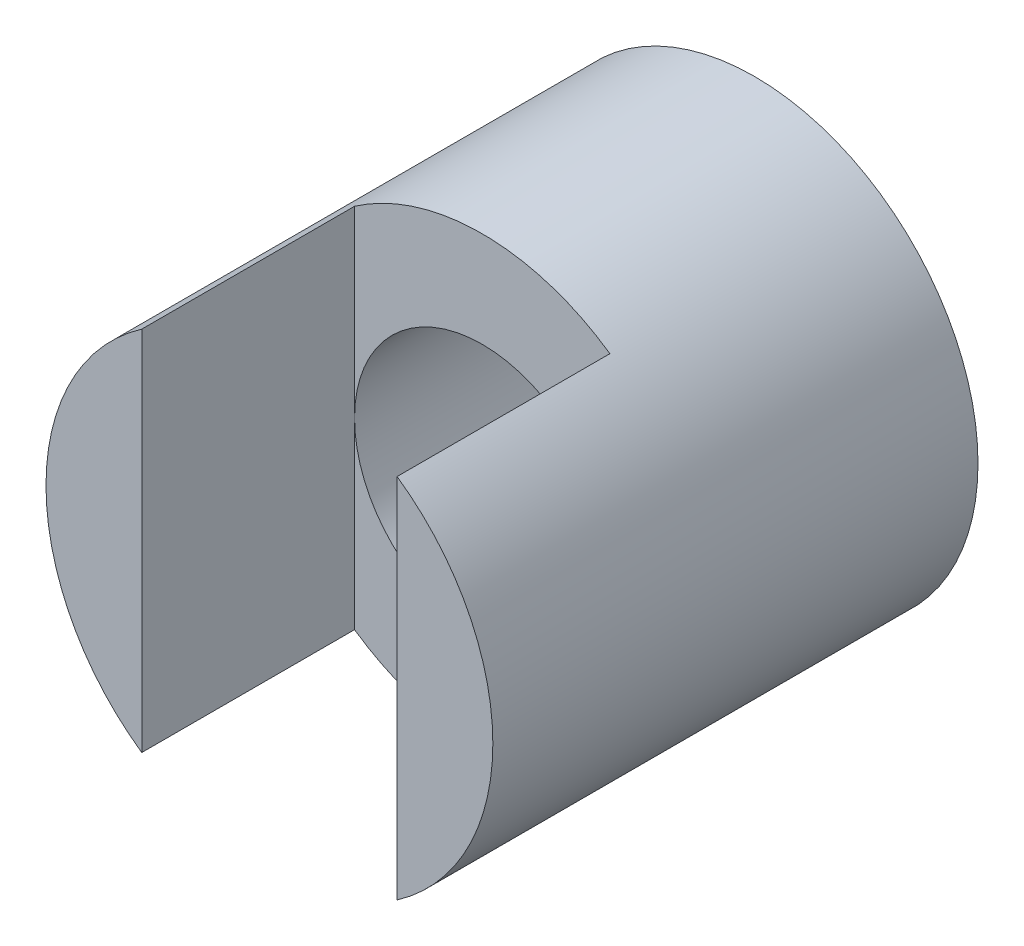
ISO-10303-21;
HEADER;
FILE_DESCRIPTION(('STEP AP214'),'2;1');
FILE_NAME('part.step','',(''),(''),'','','');
FILE_SCHEMA(('AUTOMOTIVE_DESIGN { 1 0 10303 214 1 1 1 1 }'));
ENDSEC;
DATA;
#1=APPLICATION_CONTEXT('core data for automotive mechanical design processes');
#2=APPLICATION_PROTOCOL_DEFINITION('international standard','automotive_design',2000,#1);
#3=PRODUCT_CONTEXT('',#1,'mechanical');
#4=PRODUCT('Part','Part','',(#3));
#5=PRODUCT_RELATED_PRODUCT_CATEGORY('part','',(#4));
#6=PRODUCT_DEFINITION_FORMATION('','',#4);
#7=PRODUCT_DEFINITION_CONTEXT('part definition',#1,'design');
#8=PRODUCT_DEFINITION('design','',#6,#7);
#9=PRODUCT_DEFINITION_SHAPE('','',#8);
#10=(LENGTH_UNIT() NAMED_UNIT(*) SI_UNIT(.MILLI.,.METRE.));
#11=(NAMED_UNIT(*) PLANE_ANGLE_UNIT() SI_UNIT($,.RADIAN.));
#12=(NAMED_UNIT(*) SI_UNIT($,.STERADIAN.) SOLID_ANGLE_UNIT());
#13=UNCERTAINTY_MEASURE_WITH_UNIT(LENGTH_MEASURE(1.E-05),#10,'distance_accuracy_value','');
#14=(GEOMETRIC_REPRESENTATION_CONTEXT(3) GLOBAL_UNCERTAINTY_ASSIGNED_CONTEXT((#13)) GLOBAL_UNIT_ASSIGNED_CONTEXT((#10,
#11,#12)) REPRESENTATION_CONTEXT('',''));
#15=CARTESIAN_POINT('',(0.,0.,0.));
#16=DIRECTION('',(0.,0.,1.));
#17=DIRECTION('',(1.,0.,0.));
#18=AXIS2_PLACEMENT_3D('',#15,#16,#17);
#19=CARTESIAN_POINT('',(4.125,0.,5.));
#20=DIRECTION('',(0.,0.,1.));
#21=DIRECTION('',(1.,0.,0.));
#22=AXIS2_PLACEMENT_3D('',#19,#20,#21);
#23=PLANE('',#22);
#24=CARTESIAN_POINT('',(0.,0.,5.));
#25=DIRECTION('',(0.,0.,1.));
#26=DIRECTION('',(1.,0.,0.));
#27=AXIS2_PLACEMENT_3D('',#24,#25,#26);
#28=CIRCLE('',#27,5.25);
#29=CARTESIAN_POINT('',(3.,-4.30842198490352,5.));
#30=VERTEX_POINT('',#29);
#31=CARTESIAN_POINT('',(3.,4.30842198490352,5.));
#32=VERTEX_POINT('',#31);
#33=EDGE_CURVE('E25',#30,#32,#28,.T.);
#34=ORIENTED_EDGE('',*,*,#33,.T.);
#35=DIRECTION('',(0.,-1.,0.));
#36=VECTOR('',#35,1.);
#37=CARTESIAN_POINT('',(3.,4.30842198490352,5.));
#38=LINE('',#37,#36);
#39=EDGE_CURVE('E126',#32,#30,#38,.T.);
#40=ORIENTED_EDGE('',*,*,#39,.T.);
#41=EDGE_LOOP('',(#34,#40));
#42=FACE_BOUND('',#41,.T.);
#43=ADVANCED_FACE('F17',(#42),#23,.T.);
#44=CARTESIAN_POINT('',(0.,0.,0.));
#45=DIRECTION('',(0.,0.,1.));
#46=DIRECTION('',(1.,0.,0.));
#47=AXIS2_PLACEMENT_3D('',#44,#45,#46);
#48=CYLINDRICAL_SURFACE('',#47,5.25);
#49=DIRECTION('',(0.,0.,1.));
#50=VECTOR('',#49,1.);
#51=CARTESIAN_POINT('',(3.,4.30842198490352,0.));
#52=LINE('',#51,#50);
#53=CARTESIAN_POINT('',(3.,4.30842198490352,0.));
#54=VERTEX_POINT('',#53);
#55=EDGE_CURVE('E129',#54,#32,#52,.T.);
#56=ORIENTED_EDGE('',*,*,#55,.T.);
#57=ORIENTED_EDGE('',*,*,#33,.F.);
#58=DIRECTION('',(0.,0.,1.));
#59=VECTOR('',#58,1.);
#60=CARTESIAN_POINT('',(3.,-4.30842198490352,0.));
#61=LINE('',#60,#59);
#62=CARTESIAN_POINT('',(3.,-4.30842198490352,0.));
#63=VERTEX_POINT('',#62);
#64=EDGE_CURVE('E84',#63,#30,#61,.T.);
#65=ORIENTED_EDGE('',*,*,#64,.F.);
#66=CARTESIAN_POINT('',(0.,0.,0.));
#67=DIRECTION('',(0.,0.,1.));
#68=DIRECTION('',(1.,0.,0.));
#69=AXIS2_PLACEMENT_3D('',#66,#67,#68);
#70=CIRCLE('',#69,5.25);
#71=CARTESIAN_POINT('',(-3.,-4.30842198490352,0.));
#72=VERTEX_POINT('',#71);
#73=EDGE_CURVE('E93',#72,#63,#70,.T.);
#74=ORIENTED_EDGE('',*,*,#73,.F.);
#75=DIRECTION('',(0.,0.,1.));
#76=VECTOR('',#75,1.);
#77=CARTESIAN_POINT('',(-3.,-4.30842198490352,0.));
#78=LINE('',#77,#76);
#79=CARTESIAN_POINT('',(-3.,-4.30842198490352,5.));
#80=VERTEX_POINT('',#79);
#81=EDGE_CURVE('E86',#72,#80,#78,.T.);
#82=ORIENTED_EDGE('',*,*,#81,.T.);
#83=CARTESIAN_POINT('',(0.,0.,5.));
#84=DIRECTION('',(0.,0.,1.));
#85=DIRECTION('',(1.,0.,0.));
#86=AXIS2_PLACEMENT_3D('',#83,#84,#85);
#87=CIRCLE('',#86,5.25);
#88=CARTESIAN_POINT('',(-5.25,0.,5.));
#89=VERTEX_POINT('',#88);
#90=EDGE_CURVE('E80',#89,#80,#87,.T.);
#91=ORIENTED_EDGE('',*,*,#90,.F.);
#92=DIRECTION('',(0.,0.,-1.));
#93=VECTOR('',#92,1.);
#94=CARTESIAN_POINT('',(-5.25,0.,0.));
#95=LINE('',#94,#93);
#96=CARTESIAN_POINT('',(-5.25,0.,-6.4));
#97=VERTEX_POINT('',#96);
#98=EDGE_CURVE('E11',#89,#97,#95,.T.);
#99=ORIENTED_EDGE('',*,*,#98,.T.);
#100=CARTESIAN_POINT('',(0.,0.,-6.4));
#101=DIRECTION('',(0.,0.,-1.));
#102=DIRECTION('',(1.,0.,0.));
#103=AXIS2_PLACEMENT_3D('',#100,#101,#102);
#104=CIRCLE('',#103,5.25);
#105=EDGE_CURVE('E106',#97,#97,#104,.T.);
#106=ORIENTED_EDGE('',*,*,#105,.F.);
#107=ORIENTED_EDGE('',*,*,#98,.F.);
#108=CARTESIAN_POINT('',(0.,0.,5.));
#109=DIRECTION('',(0.,0.,1.));
#110=DIRECTION('',(1.,0.,0.));
#111=AXIS2_PLACEMENT_3D('',#108,#109,#110);
#112=CIRCLE('',#111,5.25);
#113=CARTESIAN_POINT('',(-3.,4.30842198490352,5.));
#114=VERTEX_POINT('',#113);
#115=EDGE_CURVE('E83',#114,#89,#112,.T.);
#116=ORIENTED_EDGE('',*,*,#115,.F.);
#117=DIRECTION('',(0.,0.,1.));
#118=VECTOR('',#117,1.);
#119=CARTESIAN_POINT('',(-3.,4.30842198490352,0.));
#120=LINE('',#119,#118);
#121=CARTESIAN_POINT('',(-3.,4.30842198490352,0.));
#122=VERTEX_POINT('',#121);
#123=EDGE_CURVE('E97',#122,#114,#120,.T.);
#124=ORIENTED_EDGE('',*,*,#123,.F.);
#125=CARTESIAN_POINT('',(0.,0.,0.));
#126=DIRECTION('',(0.,0.,1.));
#127=DIRECTION('',(1.,0.,0.));
#128=AXIS2_PLACEMENT_3D('',#125,#126,#127);
#129=CIRCLE('',#128,5.25);
#130=EDGE_CURVE('E115',#54,#122,#129,.T.);
#131=ORIENTED_EDGE('',*,*,#130,.F.);
#132=EDGE_LOOP('',(#56,#57,#65,#74,#82,#91,#99,#106,#107,#116,#124,#131));
#133=FACE_BOUND('',#132,.T.);
#134=ADVANCED_FACE('F90',(#133),#48,.T.);
#135=CARTESIAN_POINT('',(3.,4.30842198490352,0.));
#136=DIRECTION('',(-1.,0.,0.));
#137=DIRECTION('',(0.,0.,1.));
#138=AXIS2_PLACEMENT_3D('',#135,#136,#137);
#139=PLANE('',#138);
#140=DIRECTION('',(0.,-1.,0.));
#141=VECTOR('',#140,1.);
#142=CARTESIAN_POINT('',(3.,4.30842198490352,0.));
#143=LINE('',#142,#141);
#144=CARTESIAN_POINT('',(3.,0.,0.));
#145=VERTEX_POINT('',#144);
#146=EDGE_CURVE('E109',#54,#145,#143,.T.);
#147=ORIENTED_EDGE('',*,*,#146,.T.);
#148=DIRECTION('',(0.,-1.,0.));
#149=VECTOR('',#148,1.);
#150=CARTESIAN_POINT('',(3.,4.30842198490352,0.));
#151=LINE('',#150,#149);
#152=EDGE_CURVE('E215',#145,#63,#151,.T.);
#153=ORIENTED_EDGE('',*,*,#152,.T.);
#154=ORIENTED_EDGE('',*,*,#64,.T.);
#155=ORIENTED_EDGE('',*,*,#39,.F.);
#156=ORIENTED_EDGE('',*,*,#55,.F.);
#157=EDGE_LOOP('',(#147,#153,#154,#155,#156));
#158=FACE_BOUND('',#157,.T.);
#159=ADVANCED_FACE('F226',(#158),#139,.T.);
#160=CARTESIAN_POINT('',(-4.125,0.,5.));
#161=DIRECTION('',(0.,0.,1.));
#162=DIRECTION('',(1.,0.,0.));
#163=AXIS2_PLACEMENT_3D('',#160,#161,#162);
#164=PLANE('',#163);
#165=DIRECTION('',(0.,1.,0.));
#166=VECTOR('',#165,1.);
#167=CARTESIAN_POINT('',(-3.,-4.30842198490352,5.));
#168=LINE('',#167,#166);
#169=EDGE_CURVE('E81',#80,#114,#168,.T.);
#170=ORIENTED_EDGE('',*,*,#169,.T.);
#171=ORIENTED_EDGE('',*,*,#115,.T.);
#172=ORIENTED_EDGE('',*,*,#90,.T.);
#173=EDGE_LOOP('',(#170,#171,#172));
#174=FACE_BOUND('',#173,.T.);
#175=ADVANCED_FACE('F78',(#174),#164,.T.);
#176=CARTESIAN_POINT('',(-3.,-4.30842198490352,0.));
#177=DIRECTION('',(1.,0.,0.));
#178=DIRECTION('',(0.,1.,0.));
#179=AXIS2_PLACEMENT_3D('',#176,#177,#178);
#180=PLANE('',#179);
#181=DIRECTION('',(0.,1.,0.));
#182=VECTOR('',#181,1.);
#183=CARTESIAN_POINT('',(-3.,-4.30842198490352,0.));
#184=LINE('',#183,#182);
#185=CARTESIAN_POINT('',(-3.,0.,0.));
#186=VERTEX_POINT('',#185);
#187=EDGE_CURVE('E192',#72,#186,#184,.T.);
#188=ORIENTED_EDGE('',*,*,#187,.T.);
#189=DIRECTION('',(0.,1.,0.));
#190=VECTOR('',#189,1.);
#191=CARTESIAN_POINT('',(-3.,-4.30842198490352,0.));
#192=LINE('',#191,#190);
#193=EDGE_CURVE('E116',#186,#122,#192,.T.);
#194=ORIENTED_EDGE('',*,*,#193,.T.);
#195=ORIENTED_EDGE('',*,*,#123,.T.);
#196=ORIENTED_EDGE('',*,*,#169,.F.);
#197=ORIENTED_EDGE('',*,*,#81,.F.);
#198=EDGE_LOOP('',(#188,#194,#195,#196,#197));
#199=FACE_BOUND('',#198,.T.);
#200=ADVANCED_FACE('F100',(#199),#180,.T.);
#201=CARTESIAN_POINT('',(0.,0.,-6.4));
#202=DIRECTION('',(0.,0.,1.));
#203=DIRECTION('',(1.,0.,0.));
#204=AXIS2_PLACEMENT_3D('',#201,#202,#203);
#205=PLANE('',#204);
#206=CARTESIAN_POINT('',(0.,0.,-6.4));
#207=DIRECTION('',(0.,0.,1.));
#208=DIRECTION('',(-1.,0.,0.));
#209=AXIS2_PLACEMENT_3D('',#206,#207,#208);
#210=CIRCLE('',#209,3.);
#211=CARTESIAN_POINT('',(3.,0.,-6.4));
#212=VERTEX_POINT('',#211);
#213=EDGE_CURVE('E190',#212,#212,#210,.T.);
#214=ORIENTED_EDGE('',*,*,#213,.T.);
#215=EDGE_LOOP('',(#214));
#216=FACE_BOUND('',#215,.T.);
#217=ORIENTED_EDGE('',*,*,#105,.T.);
#218=EDGE_LOOP('',(#217));
#219=FACE_BOUND('',#218,.T.);
#220=ADVANCED_FACE('F250',(#216,#219),#205,.F.);
#221=CARTESIAN_POINT('',(0.,0.,0.));
#222=DIRECTION('',(0.,0.,1.));
#223=DIRECTION('',(1.,0.,0.));
#224=AXIS2_PLACEMENT_3D('',#221,#222,#223);
#225=PLANE('',#224);
#226=ORIENTED_EDGE('',*,*,#146,.F.);
#227=ORIENTED_EDGE('',*,*,#130,.T.);
#228=ORIENTED_EDGE('',*,*,#193,.F.);
#229=CARTESIAN_POINT('',(0.,0.,0.));
#230=DIRECTION('',(0.,0.,-1.));
#231=DIRECTION('',(-1.,0.,0.));
#232=AXIS2_PLACEMENT_3D('',#229,#230,#231);
#233=CIRCLE('',#232,3.);
#234=EDGE_CURVE('E175',#186,#145,#233,.T.);
#235=ORIENTED_EDGE('',*,*,#234,.T.);
#236=EDGE_LOOP('',(#226,#227,#228,#235));
#237=FACE_BOUND('',#236,.T.);
#238=ADVANCED_FACE('F249',(#237),#225,.T.);
#239=CARTESIAN_POINT('',(0.,0.,0.));
#240=DIRECTION('',(0.,0.,-1.));
#241=DIRECTION('',(-1.,0.,0.));
#242=AXIS2_PLACEMENT_3D('',#239,#240,#241);
#243=CYLINDRICAL_SURFACE('',#242,3.);
#244=ORIENTED_EDGE('',*,*,#213,.F.);
#245=DIRECTION('',(0.,0.,1.));
#246=VECTOR('',#245,1.);
#247=CARTESIAN_POINT('',(3.,0.,0.));
#248=LINE('',#247,#246);
#249=EDGE_CURVE('E185',#212,#145,#248,.T.);
#250=ORIENTED_EDGE('',*,*,#249,.T.);
#251=ORIENTED_EDGE('',*,*,#234,.F.);
#252=CARTESIAN_POINT('',(0.,0.,0.));
#253=DIRECTION('',(0.,0.,-1.));
#254=DIRECTION('',(-1.,0.,0.));
#255=AXIS2_PLACEMENT_3D('',#252,#253,#254);
#256=CIRCLE('',#255,3.);
#257=EDGE_CURVE('E202',#145,#186,#256,.T.);
#258=ORIENTED_EDGE('',*,*,#257,.F.);
#259=ORIENTED_EDGE('',*,*,#249,.F.);
#260=EDGE_LOOP('',(#244,#250,#251,#258,#259));
#261=FACE_BOUND('',#260,.T.);
#262=ADVANCED_FACE('F243',(#261),#243,.F.);
#263=CARTESIAN_POINT('',(0.,0.,0.));
#264=DIRECTION('',(0.,0.,1.));
#265=DIRECTION('',(1.,0.,0.));
#266=AXIS2_PLACEMENT_3D('',#263,#264,#265);
#267=PLANE('',#266);
#268=ORIENTED_EDGE('',*,*,#152,.F.);
#269=ORIENTED_EDGE('',*,*,#257,.T.);
#270=ORIENTED_EDGE('',*,*,#187,.F.);
#271=ORIENTED_EDGE('',*,*,#73,.T.);
#272=EDGE_LOOP('',(#268,#269,#270,#271));
#273=FACE_BOUND('',#272,.T.);
#274=ADVANCED_FACE('F233',(#273),#267,.T.);
#275=CLOSED_SHELL('',(#43,#134,#159,#175,#200,#220,#238,#262,#274));
#276=MANIFOLD_SOLID_BREP('B1',#275);
#277=ADVANCED_BREP_SHAPE_REPRESENTATION('',(#18,#276),#14);
#278=SHAPE_DEFINITION_REPRESENTATION(#9,#277);
ENDSEC;
END-ISO-10303-21;
